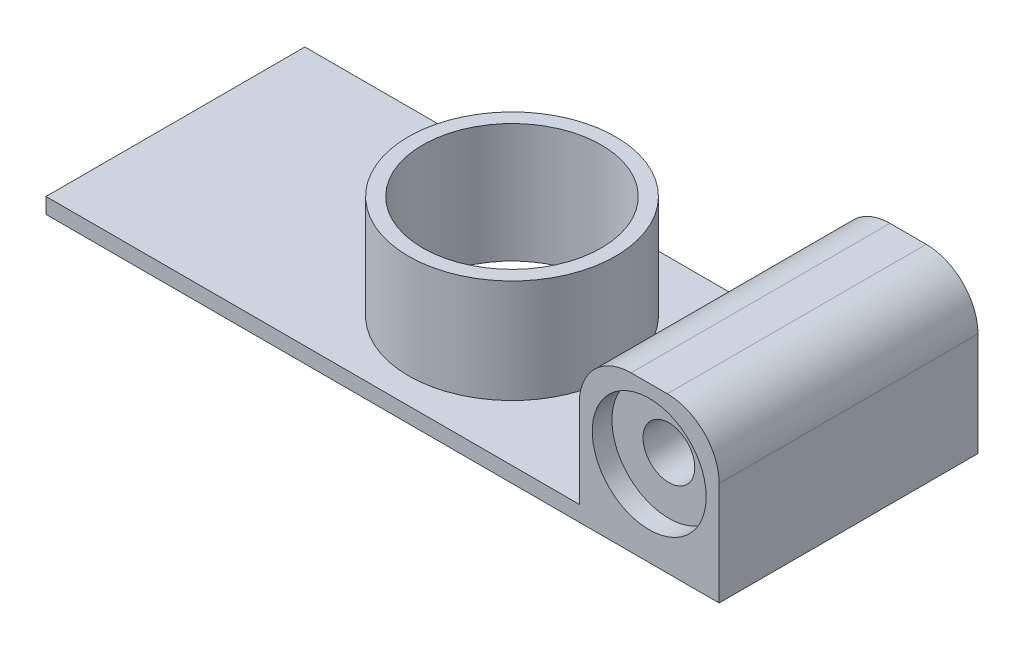
ISO-10303-21;
HEADER;
FILE_DESCRIPTION(('STEP AP214'),'2;1');
FILE_NAME('part.step','',(''),(''),'','','');
FILE_SCHEMA(('AUTOMOTIVE_DESIGN { 1 0 10303 214 1 1 1 1 }'));
ENDSEC;
DATA;
#1=APPLICATION_CONTEXT('core data for automotive mechanical design processes');
#2=APPLICATION_PROTOCOL_DEFINITION('international standard','automotive_design',2000,#1);
#3=PRODUCT_CONTEXT('',#1,'mechanical');
#4=PRODUCT('Part','Part','',(#3));
#5=PRODUCT_RELATED_PRODUCT_CATEGORY('part','',(#4));
#6=PRODUCT_DEFINITION_FORMATION('','',#4);
#7=PRODUCT_DEFINITION_CONTEXT('part definition',#1,'design');
#8=PRODUCT_DEFINITION('design','',#6,#7);
#9=PRODUCT_DEFINITION_SHAPE('','',#8);
#10=(LENGTH_UNIT() NAMED_UNIT(*) SI_UNIT(.MILLI.,.METRE.));
#11=(NAMED_UNIT(*) PLANE_ANGLE_UNIT() SI_UNIT($,.RADIAN.));
#12=(NAMED_UNIT(*) SI_UNIT($,.STERADIAN.) SOLID_ANGLE_UNIT());
#13=UNCERTAINTY_MEASURE_WITH_UNIT(LENGTH_MEASURE(1.E-05),#10,'distance_accuracy_value','');
#14=(GEOMETRIC_REPRESENTATION_CONTEXT(3) GLOBAL_UNCERTAINTY_ASSIGNED_CONTEXT((#13)) GLOBAL_UNIT_ASSIGNED_CONTEXT((#10,
#11,#12)) REPRESENTATION_CONTEXT('',''));
#15=CARTESIAN_POINT('',(0.,0.,0.));
#16=DIRECTION('',(0.,0.,1.));
#17=DIRECTION('',(1.,0.,0.));
#18=AXIS2_PLACEMENT_3D('',#15,#16,#17);
#19=CARTESIAN_POINT('',(65.,6.,-25.));
#20=DIRECTION('',(-1.,0.,0.));
#21=DIRECTION('',(0.,0.,1.));
#22=AXIS2_PLACEMENT_3D('',#19,#20,#21);
#23=PLANE('',#22);
#24=DIRECTION('',(0.,0.,1.));
#25=VECTOR('',#24,1.);
#26=CARTESIAN_POINT('',(65.,3.,25.));
#27=LINE('',#26,#25);
#28=CARTESIAN_POINT('',(65.,3.,-25.));
#29=VERTEX_POINT('',#28);
#30=CARTESIAN_POINT('',(65.,3.,25.));
#31=VERTEX_POINT('',#30);
#32=EDGE_CURVE('E57',#29,#31,#27,.T.);
#33=ORIENTED_EDGE('',*,*,#32,.F.);
#34=DIRECTION('',(0.,-1.,0.));
#35=VECTOR('',#34,1.);
#36=CARTESIAN_POINT('',(65.,6.,-25.));
#37=LINE('',#36,#35);
#38=CARTESIAN_POINT('',(65.,23.,-25.));
#39=VERTEX_POINT('',#38);
#40=EDGE_CURVE('E124',#39,#29,#37,.T.);
#41=ORIENTED_EDGE('',*,*,#40,.F.);
#42=DIRECTION('',(0.,0.,-1.));
#43=VECTOR('',#42,1.);
#44=CARTESIAN_POINT('',(65.,23.,25.));
#45=LINE('',#44,#43);
#46=CARTESIAN_POINT('',(65.,23.,25.));
#47=VERTEX_POINT('',#46);
#48=EDGE_CURVE('E50',#39,#47,#45,.F.);
#49=ORIENTED_EDGE('',*,*,#48,.T.);
#50=DIRECTION('',(0.,-1.,0.));
#51=VECTOR('',#50,1.);
#52=CARTESIAN_POINT('',(65.,6.,25.));
#53=LINE('',#52,#51);
#54=EDGE_CURVE('E136',#47,#31,#53,.T.);
#55=ORIENTED_EDGE('',*,*,#54,.T.);
#56=EDGE_LOOP('',(#33,#41,#49,#55));
#57=FACE_BOUND('',#56,.T.);
#58=ADVANCED_FACE('F40',(#57),#23,.F.);
#59=CARTESIAN_POINT('',(-65.,6.,-25.));
#60=DIRECTION('',(0.,0.,1.));
#61=DIRECTION('',(1.,0.,0.));
#62=AXIS2_PLACEMENT_3D('',#59,#60,#61);
#63=PLANE('',#62);
#64=CARTESIAN_POINT('',(51.5,19.5,-25.));
#65=DIRECTION('',(0.,0.,-1.));
#66=DIRECTION('',(-1.,0.,0.));
#67=AXIS2_PLACEMENT_3D('',#64,#65,#66);
#68=CIRCLE('',#67,11.);
#69=CARTESIAN_POINT('',(40.5,19.5,-25.));
#70=VERTEX_POINT('',#69);
#71=EDGE_CURVE('E416',#70,#70,#68,.T.);
#72=ORIENTED_EDGE('',*,*,#71,.F.);
#73=EDGE_LOOP('',(#72));
#74=FACE_BOUND('',#73,.T.);
#75=DIRECTION('',(1.,0.,0.));
#76=VECTOR('',#75,1.);
#77=CARTESIAN_POINT('',(-65.,3.,-25.));
#78=LINE('',#77,#76);
#79=CARTESIAN_POINT('',(-65.,3.,-25.));
#80=VERTEX_POINT('',#79);
#81=EDGE_CURVE('E109',#80,#29,#78,.T.);
#82=ORIENTED_EDGE('',*,*,#81,.F.);
#83=DIRECTION('',(0.,-1.,0.));
#84=VECTOR('',#83,1.);
#85=CARTESIAN_POINT('',(-65.,6.,-25.));
#86=LINE('',#85,#84);
#87=CARTESIAN_POINT('',(-65.,6.,-25.));
#88=VERTEX_POINT('',#87);
#89=EDGE_CURVE('E122',#88,#80,#86,.T.);
#90=ORIENTED_EDGE('',*,*,#89,.F.);
#91=DIRECTION('',(-1.,0.,0.));
#92=VECTOR('',#91,1.);
#93=CARTESIAN_POINT('',(-65.,6.,-25.));
#94=LINE('',#93,#92);
#95=CARTESIAN_POINT('',(38.,6.,-25.));
#96=VERTEX_POINT('',#95);
#97=EDGE_CURVE('E193',#96,#88,#94,.T.);
#98=ORIENTED_EDGE('',*,*,#97,.F.);
#99=DIRECTION('',(0.,-1.,0.));
#100=VECTOR('',#99,1.);
#101=CARTESIAN_POINT('',(38.,33.,-25.));
#102=LINE('',#101,#100);
#103=CARTESIAN_POINT('',(38.,23.,-25.));
#104=VERTEX_POINT('',#103);
#105=EDGE_CURVE('E179',#104,#96,#102,.T.);
#106=ORIENTED_EDGE('',*,*,#105,.F.);
#107=CARTESIAN_POINT('',(48.,23.,-25.));
#108=DIRECTION('',(0.,0.,1.));
#109=DIRECTION('',(1.,0.,0.));
#110=AXIS2_PLACEMENT_3D('',#107,#108,#109);
#111=CIRCLE('',#110,10.);
#112=CARTESIAN_POINT('',(48.,33.,-25.));
#113=VERTEX_POINT('',#112);
#114=EDGE_CURVE('E149',#104,#113,#111,.F.);
#115=ORIENTED_EDGE('',*,*,#114,.T.);
#116=DIRECTION('',(-1.,0.,0.));
#117=VECTOR('',#116,1.);
#118=CARTESIAN_POINT('',(38.,33.,-25.));
#119=LINE('',#118,#117);
#120=CARTESIAN_POINT('',(55.,33.,-25.));
#121=VERTEX_POINT('',#120);
#122=EDGE_CURVE('E162',#121,#113,#119,.T.);
#123=ORIENTED_EDGE('',*,*,#122,.F.);
#124=CARTESIAN_POINT('',(55.,23.,-25.));
#125=DIRECTION('',(0.,0.,1.));
#126=DIRECTION('',(1.,0.,0.));
#127=AXIS2_PLACEMENT_3D('',#124,#125,#126);
#128=CIRCLE('',#127,10.);
#129=EDGE_CURVE('E157',#121,#39,#128,.F.);
#130=ORIENTED_EDGE('',*,*,#129,.T.);
#131=ORIENTED_EDGE('',*,*,#40,.T.);
#132=EDGE_LOOP('',(#82,#90,#98,#106,#115,#123,#130,#131));
#133=FACE_BOUND('',#132,.T.);
#134=ADVANCED_FACE('F120',(#74,#133),#63,.F.);
#135=CARTESIAN_POINT('',(-65.,6.,-25.));
#136=DIRECTION('',(1.,0.,0.));
#137=DIRECTION('',(0.,0.,-1.));
#138=AXIS2_PLACEMENT_3D('',#135,#136,#137);
#139=PLANE('',#138);
#140=DIRECTION('',(0.,0.,-1.));
#141=VECTOR('',#140,1.);
#142=CARTESIAN_POINT('',(-65.,3.,25.));
#143=LINE('',#142,#141);
#144=CARTESIAN_POINT('',(-65.,3.,25.));
#145=VERTEX_POINT('',#144);
#146=EDGE_CURVE('E105',#145,#80,#143,.T.);
#147=ORIENTED_EDGE('',*,*,#146,.F.);
#148=DIRECTION('',(0.,-1.,0.));
#149=VECTOR('',#148,1.);
#150=CARTESIAN_POINT('',(-65.,6.,25.));
#151=LINE('',#150,#149);
#152=CARTESIAN_POINT('',(-65.,6.,25.));
#153=VERTEX_POINT('',#152);
#154=EDGE_CURVE('E130',#153,#145,#151,.T.);
#155=ORIENTED_EDGE('',*,*,#154,.F.);
#156=DIRECTION('',(0.,0.,1.));
#157=VECTOR('',#156,1.);
#158=CARTESIAN_POINT('',(-65.,6.,-25.));
#159=LINE('',#158,#157);
#160=EDGE_CURVE('E128',#88,#153,#159,.T.);
#161=ORIENTED_EDGE('',*,*,#160,.F.);
#162=ORIENTED_EDGE('',*,*,#89,.T.);
#163=EDGE_LOOP('',(#147,#155,#161,#162));
#164=FACE_BOUND('',#163,.T.);
#165=ADVANCED_FACE('F127',(#164),#139,.F.);
#166=CARTESIAN_POINT('',(-65.,6.,25.));
#167=DIRECTION('',(0.,0.,-1.));
#168=DIRECTION('',(-1.,0.,0.));
#169=AXIS2_PLACEMENT_3D('',#166,#167,#168);
#170=PLANE('',#169);
#171=CARTESIAN_POINT('',(51.5,19.5,25.));
#172=DIRECTION('',(0.,0.,1.));
#173=DIRECTION('',(1.,0.,0.));
#174=AXIS2_PLACEMENT_3D('',#171,#172,#173);
#175=CIRCLE('',#174,11.);
#176=CARTESIAN_POINT('',(62.5,19.5,25.));
#177=VERTEX_POINT('',#176);
#178=EDGE_CURVE('E185',#177,#177,#175,.T.);
#179=ORIENTED_EDGE('',*,*,#178,.F.);
#180=EDGE_LOOP('',(#179));
#181=FACE_BOUND('',#180,.T.);
#182=DIRECTION('',(-1.,0.,0.));
#183=VECTOR('',#182,1.);
#184=CARTESIAN_POINT('',(-65.,3.,25.));
#185=LINE('',#184,#183);
#186=EDGE_CURVE('E110',#31,#145,#185,.T.);
#187=ORIENTED_EDGE('',*,*,#186,.F.);
#188=ORIENTED_EDGE('',*,*,#54,.F.);
#189=CARTESIAN_POINT('',(55.,23.,25.));
#190=DIRECTION('',(0.,0.,-1.));
#191=DIRECTION('',(-1.,0.,0.));
#192=AXIS2_PLACEMENT_3D('',#189,#190,#191);
#193=CIRCLE('',#192,10.);
#194=CARTESIAN_POINT('',(55.,33.,25.));
#195=VERTEX_POINT('',#194);
#196=EDGE_CURVE('E11',#47,#195,#193,.F.);
#197=ORIENTED_EDGE('',*,*,#196,.T.);
#198=DIRECTION('',(1.,0.,0.));
#199=VECTOR('',#198,1.);
#200=CARTESIAN_POINT('',(38.,33.,25.));
#201=LINE('',#200,#199);
#202=CARTESIAN_POINT('',(48.,33.,25.));
#203=VERTEX_POINT('',#202);
#204=EDGE_CURVE('E170',#203,#195,#201,.T.);
#205=ORIENTED_EDGE('',*,*,#204,.F.);
#206=CARTESIAN_POINT('',(48.,23.,25.));
#207=DIRECTION('',(0.,0.,-1.));
#208=DIRECTION('',(-1.,0.,0.));
#209=AXIS2_PLACEMENT_3D('',#206,#207,#208);
#210=CIRCLE('',#209,10.);
#211=CARTESIAN_POINT('',(38.,23.,25.));
#212=VERTEX_POINT('',#211);
#213=EDGE_CURVE('E143',#203,#212,#210,.F.);
#214=ORIENTED_EDGE('',*,*,#213,.T.);
#215=DIRECTION('',(0.,-1.,0.));
#216=VECTOR('',#215,1.);
#217=CARTESIAN_POINT('',(38.,33.,25.));
#218=LINE('',#217,#216);
#219=CARTESIAN_POINT('',(38.,6.,25.));
#220=VERTEX_POINT('',#219);
#221=EDGE_CURVE('E190',#212,#220,#218,.T.);
#222=ORIENTED_EDGE('',*,*,#221,.T.);
#223=DIRECTION('',(1.,0.,0.));
#224=VECTOR('',#223,1.);
#225=CARTESIAN_POINT('',(-65.,6.,25.));
#226=LINE('',#225,#224);
#227=EDGE_CURVE('E198',#153,#220,#226,.T.);
#228=ORIENTED_EDGE('',*,*,#227,.F.);
#229=ORIENTED_EDGE('',*,*,#154,.T.);
#230=EDGE_LOOP('',(#187,#188,#197,#205,#214,#222,#228,#229));
#231=FACE_BOUND('',#230,.T.);
#232=ADVANCED_FACE('F169',(#181,#231),#170,.F.);
#233=CARTESIAN_POINT('',(0.,-34.,0.));
#234=DIRECTION('',(0.,1.,0.));
#235=DIRECTION('',(0.,0.,1.));
#236=AXIS2_PLACEMENT_3D('',#233,#234,#235);
#237=CYLINDRICAL_SURFACE('',#236,17.25);
#238=CARTESIAN_POINT('',(0.,26.,0.));
#239=DIRECTION('',(0.,1.,0.));
#240=DIRECTION('',(0.,0.,1.));
#241=AXIS2_PLACEMENT_3D('',#238,#239,#240);
#242=CIRCLE('',#241,17.25);
#243=CARTESIAN_POINT('',(0.,26.,17.25));
#244=VERTEX_POINT('',#243);
#245=EDGE_CURVE('E393',#244,#244,#242,.T.);
#246=CARTESIAN_POINT('',(0.,3.,0.));
#247=DIRECTION('',(0.,-1.,0.));
#248=DIRECTION('',(0.,0.,-1.));
#249=AXIS2_PLACEMENT_3D('',#246,#247,#248);
#250=CIRCLE('',#249,17.25);
#251=CARTESIAN_POINT('',(0.,3.00000000000001,17.25));
#252=VERTEX_POINT('',#251);
#253=EDGE_CURVE('E44',#252,#252,#250,.F.);
#254=CARTESIAN_POINT('',(0.,26.,17.25));
#255=CARTESIAN_POINT('',(0.,25.7604166666667,17.25));
#256=CARTESIAN_POINT('',(0.,25.5208333333333,17.25));
#257=CARTESIAN_POINT('',(0.,25.0416666666667,17.25));
#258=CARTESIAN_POINT('',(0.,24.8020833333333,17.25));
#259=CARTESIAN_POINT('',(0.,24.3229166666667,17.25));
#260=CARTESIAN_POINT('',(0.,24.0833333333333,17.25));
#261=CARTESIAN_POINT('',(0.,23.6041666666667,17.25));
#262=CARTESIAN_POINT('',(0.,23.3645833333333,17.25));
#263=CARTESIAN_POINT('',(0.,22.8854166666667,17.25));
#264=CARTESIAN_POINT('',(0.,22.6458333333333,17.25));
#265=CARTESIAN_POINT('',(0.,22.1666666666667,17.25));
#266=CARTESIAN_POINT('',(0.,21.9270833333333,17.25));
#267=CARTESIAN_POINT('',(0.,21.4479166666667,17.25));
#268=CARTESIAN_POINT('',(0.,21.2083333333333,17.25));
#269=CARTESIAN_POINT('',(0.,20.7291666666667,17.25));
#270=CARTESIAN_POINT('',(0.,20.4895833333333,17.25));
#271=CARTESIAN_POINT('',(0.,20.0104166666667,17.25));
#272=CARTESIAN_POINT('',(0.,19.7708333333333,17.25));
#273=CARTESIAN_POINT('',(0.,19.2916666666667,17.25));
#274=CARTESIAN_POINT('',(0.,19.0520833333333,17.25));
#275=CARTESIAN_POINT('',(0.,18.5729166666667,17.25));
#276=CARTESIAN_POINT('',(0.,18.3333333333333,17.25));
#277=CARTESIAN_POINT('',(0.,17.8541666666667,17.25));
#278=CARTESIAN_POINT('',(0.,17.6145833333333,17.25));
#279=CARTESIAN_POINT('',(0.,17.1354166666667,17.25));
#280=CARTESIAN_POINT('',(0.,16.8958333333333,17.25));
#281=CARTESIAN_POINT('',(0.,16.4166666666667,17.25));
#282=CARTESIAN_POINT('',(0.,16.1770833333333,17.25));
#283=CARTESIAN_POINT('',(0.,15.6979166666667,17.25));
#284=CARTESIAN_POINT('',(0.,15.4583333333333,17.25));
#285=CARTESIAN_POINT('',(0.,14.9791666666667,17.25));
#286=CARTESIAN_POINT('',(0.,14.7395833333333,17.25));
#287=CARTESIAN_POINT('',(0.,14.2604166666667,17.25));
#288=CARTESIAN_POINT('',(0.,14.0208333333333,17.25));
#289=CARTESIAN_POINT('',(0.,13.5416666666667,17.25));
#290=CARTESIAN_POINT('',(0.,13.3020833333333,17.25));
#291=CARTESIAN_POINT('',(0.,12.8229166666667,17.25));
#292=CARTESIAN_POINT('',(0.,12.5833333333333,17.25));
#293=CARTESIAN_POINT('',(0.,12.1041666666667,17.25));
#294=CARTESIAN_POINT('',(0.,11.8645833333333,17.25));
#295=CARTESIAN_POINT('',(0.,11.3854166666667,17.25));
#296=CARTESIAN_POINT('',(0.,11.1458333333333,17.25));
#297=CARTESIAN_POINT('',(0.,10.6666666666667,17.25));
#298=CARTESIAN_POINT('',(0.,10.4270833333333,17.25));
#299=CARTESIAN_POINT('',(0.,9.94791666666667,17.25));
#300=CARTESIAN_POINT('',(0.,9.70833333333334,17.25));
#301=CARTESIAN_POINT('',(0.,9.22916666666667,17.25));
#302=CARTESIAN_POINT('',(0.,8.98958333333334,17.25));
#303=CARTESIAN_POINT('',(0.,8.51041666666667,17.25));
#304=CARTESIAN_POINT('',(0.,8.27083333333334,17.25));
#305=CARTESIAN_POINT('',(0.,7.79166666666668,17.25));
#306=CARTESIAN_POINT('',(0.,7.55208333333334,17.25));
#307=CARTESIAN_POINT('',(0.,7.07291666666667,17.25));
#308=CARTESIAN_POINT('',(0.,6.83333333333334,17.25));
#309=CARTESIAN_POINT('',(0.,6.35416666666668,17.25));
#310=CARTESIAN_POINT('',(0.,6.11458333333334,17.25));
#311=CARTESIAN_POINT('',(0.,5.63541666666668,17.25));
#312=CARTESIAN_POINT('',(0.,5.39583333333334,17.25));
#313=CARTESIAN_POINT('',(0.,4.91666666666668,17.25));
#314=CARTESIAN_POINT('',(0.,4.67708333333334,17.25));
#315=CARTESIAN_POINT('',(0.,4.19791666666668,17.25));
#316=CARTESIAN_POINT('',(0.,3.95833333333335,17.25));
#317=CARTESIAN_POINT('',(0.,3.47916666666668,17.25));
#318=CARTESIAN_POINT('',(0.,3.23958333333334,17.25));
#319=CARTESIAN_POINT('',(0.,3.00000000000001,17.25));
#320=B_SPLINE_CURVE_WITH_KNOTS('',3,(#254,#255,#256,#257,#258,#259,#260,#261,#262,#263,#264,
#265,#266,#267,#268,#269,#270,#271,#272,#273,#274,#275,#276,#277,#278,#279,#280,#281,#282,#283,
#284,#285,#286,#287,#288,#289,#290,#291,#292,#293,#294,#295,#296,#297,#298,#299,#300,#301,#302,
#303,#304,#305,#306,#307,#308,#309,#310,#311,#312,#313,#314,#315,#316,#317,#318,#319),
.UNSPECIFIED.,.F.,.F.,(4,2,2,2,2,2,2,2,2,2,2,2,2,2,2,2,2,2,2,2,2,2,2,2,2,2,2,2,2,2,2,2,4),(0.,
0.718749999999997,1.4375,2.15625,2.875,3.59375,4.3125,5.03125,5.75,6.46875,7.1875,7.90625,
8.62499999999999,9.34375,10.0625,10.78125,11.5,12.21875,12.9375,13.65625,14.375,15.09375,
15.8125,16.53125,17.25,17.96875,18.6875,19.40625,20.125,20.84375,21.5625,22.28125,23.),.UNSPECIFIED.);
#321=EDGE_CURVE('BSEAM237',#244,#252,#320,.T.);
#322=ORIENTED_EDGE('',*,*,#245,.T.);
#323=ORIENTED_EDGE('',*,*,#253,.F.);
#324=ORIENTED_EDGE('',*,*,#321,.T.);
#325=ORIENTED_EDGE('',*,*,#321,.F.);
#326=EDGE_LOOP('',(#322,#324,#323,#325));
#327=FACE_BOUND('',#326,.T.);
#328=ADVANCED_FACE('F237',(#327),#237,.F.);
#329=CARTESIAN_POINT('',(0.,6.,0.));
#330=DIRECTION('',(0.,1.,0.));
#331=DIRECTION('',(0.,0.,1.));
#332=AXIS2_PLACEMENT_3D('',#329,#330,#331);
#333=PLANE('',#332);
#334=CARTESIAN_POINT('',(0.,6.,0.));
#335=DIRECTION('',(0.,1.,0.));
#336=DIRECTION('',(0.,0.,1.));
#337=AXIS2_PLACEMENT_3D('',#334,#335,#336);
#338=CIRCLE('',#337,20.);
#339=CARTESIAN_POINT('',(0.,6.,20.));
#340=VERTEX_POINT('',#339);
#341=EDGE_CURVE('E399',#340,#340,#338,.T.);
#342=ORIENTED_EDGE('',*,*,#341,.F.);
#343=EDGE_LOOP('',(#342));
#344=FACE_BOUND('',#343,.T.);
#345=DIRECTION('',(0.,0.,1.));
#346=VECTOR('',#345,1.);
#347=CARTESIAN_POINT('',(38.,6.,-25.));
#348=LINE('',#347,#346);
#349=EDGE_CURVE('E175',#96,#220,#348,.T.);
#350=ORIENTED_EDGE('',*,*,#349,.F.);
#351=ORIENTED_EDGE('',*,*,#97,.T.);
#352=ORIENTED_EDGE('',*,*,#160,.T.);
#353=ORIENTED_EDGE('',*,*,#227,.T.);
#354=EDGE_LOOP('',(#350,#351,#352,#353));
#355=FACE_BOUND('',#354,.T.);
#356=ADVANCED_FACE('F205',(#344,#355),#333,.T.);
#357=CARTESIAN_POINT('',(38.,33.,-25.));
#358=DIRECTION('',(1.,0.,0.));
#359=DIRECTION('',(0.,0.,-1.));
#360=AXIS2_PLACEMENT_3D('',#357,#358,#359);
#361=PLANE('',#360);
#362=ORIENTED_EDGE('',*,*,#221,.F.);
#363=DIRECTION('',(0.,0.,1.));
#364=VECTOR('',#363,1.);
#365=CARTESIAN_POINT('',(38.,23.,-25.));
#366=LINE('',#365,#364);
#367=EDGE_CURVE('E146',#212,#104,#366,.F.);
#368=ORIENTED_EDGE('',*,*,#367,.T.);
#369=ORIENTED_EDGE('',*,*,#105,.T.);
#370=ORIENTED_EDGE('',*,*,#349,.T.);
#371=EDGE_LOOP('',(#362,#368,#369,#370));
#372=FACE_BOUND('',#371,.T.);
#373=ADVANCED_FACE('F208',(#372),#361,.F.);
#374=CARTESIAN_POINT('',(0.,33.,0.));
#375=DIRECTION('',(0.,1.,0.));
#376=DIRECTION('',(0.,0.,1.));
#377=AXIS2_PLACEMENT_3D('',#374,#375,#376);
#378=PLANE('',#377);
#379=ORIENTED_EDGE('',*,*,#204,.T.);
#380=DIRECTION('',(0.,0.,-1.));
#381=VECTOR('',#380,1.);
#382=CARTESIAN_POINT('',(55.,33.,-25.));
#383=LINE('',#382,#381);
#384=EDGE_CURVE('E153',#195,#121,#383,.T.);
#385=ORIENTED_EDGE('',*,*,#384,.T.);
#386=ORIENTED_EDGE('',*,*,#122,.T.);
#387=DIRECTION('',(0.,0.,1.));
#388=VECTOR('',#387,1.);
#389=CARTESIAN_POINT('',(48.,33.,25.));
#390=LINE('',#389,#388);
#391=EDGE_CURVE('E134',#113,#203,#390,.T.);
#392=ORIENTED_EDGE('',*,*,#391,.T.);
#393=EDGE_LOOP('',(#379,#385,#386,#392));
#394=FACE_BOUND('',#393,.T.);
#395=ADVANCED_FACE('F172',(#394),#378,.T.);
#396=CARTESIAN_POINT('',(51.5,19.5,21.2));
#397=DIRECTION('',(0.,0.,1.));
#398=DIRECTION('',(1.,0.,0.));
#399=AXIS2_PLACEMENT_3D('',#396,#397,#398);
#400=CYLINDRICAL_SURFACE('',#399,11.);
#401=CARTESIAN_POINT('',(51.5,19.5,21.2));
#402=DIRECTION('',(0.,0.,1.));
#403=DIRECTION('',(1.,0.,0.));
#404=AXIS2_PLACEMENT_3D('',#401,#402,#403);
#405=CIRCLE('',#404,11.);
#406=CARTESIAN_POINT('',(62.5,19.5,21.2));
#407=VERTEX_POINT('',#406);
#408=EDGE_CURVE('E182',#407,#407,#405,.T.);
#409=CARTESIAN_POINT('',(62.5,19.5,21.2));
#410=CARTESIAN_POINT('',(62.5,19.5,21.2395833333333));
#411=CARTESIAN_POINT('',(62.5,19.5,21.2791666666667));
#412=CARTESIAN_POINT('',(62.5,19.5,21.3583333333333));
#413=CARTESIAN_POINT('',(62.5,19.5,21.3979166666667));
#414=CARTESIAN_POINT('',(62.5,19.5,21.4770833333333));
#415=CARTESIAN_POINT('',(62.5,19.5,21.5166666666667));
#416=CARTESIAN_POINT('',(62.5,19.5,21.5958333333333));
#417=CARTESIAN_POINT('',(62.5,19.5,21.6354166666667));
#418=CARTESIAN_POINT('',(62.5,19.5,21.7145833333333));
#419=CARTESIAN_POINT('',(62.5,19.5,21.7541666666667));
#420=CARTESIAN_POINT('',(62.5,19.5,21.8333333333333));
#421=CARTESIAN_POINT('',(62.5,19.5,21.8729166666667));
#422=CARTESIAN_POINT('',(62.5,19.5,21.9520833333333));
#423=CARTESIAN_POINT('',(62.5,19.5,21.9916666666667));
#424=CARTESIAN_POINT('',(62.5,19.5,22.0708333333333));
#425=CARTESIAN_POINT('',(62.5,19.5,22.1104166666667));
#426=CARTESIAN_POINT('',(62.5,19.5,22.1895833333333));
#427=CARTESIAN_POINT('',(62.5,19.5,22.2291666666667));
#428=CARTESIAN_POINT('',(62.5,19.5,22.3083333333333));
#429=CARTESIAN_POINT('',(62.5,19.5,22.3479166666667));
#430=CARTESIAN_POINT('',(62.5,19.5,22.4270833333333));
#431=CARTESIAN_POINT('',(62.5,19.5,22.4666666666667));
#432=CARTESIAN_POINT('',(62.5,19.5,22.5458333333333));
#433=CARTESIAN_POINT('',(62.5,19.5,22.5854166666667));
#434=CARTESIAN_POINT('',(62.5,19.5,22.6645833333333));
#435=CARTESIAN_POINT('',(62.5,19.5,22.7041666666667));
#436=CARTESIAN_POINT('',(62.5,19.5,22.7833333333333));
#437=CARTESIAN_POINT('',(62.5,19.5,22.8229166666667));
#438=CARTESIAN_POINT('',(62.5,19.5,22.9020833333333));
#439=CARTESIAN_POINT('',(62.5,19.5,22.9416666666667));
#440=CARTESIAN_POINT('',(62.5,19.5,23.0208333333333));
#441=CARTESIAN_POINT('',(62.5,19.5,23.0604166666667));
#442=CARTESIAN_POINT('',(62.5,19.5,23.1395833333333));
#443=CARTESIAN_POINT('',(62.5,19.5,23.1791666666667));
#444=CARTESIAN_POINT('',(62.5,19.5,23.2583333333333));
#445=CARTESIAN_POINT('',(62.5,19.5,23.2979166666667));
#446=CARTESIAN_POINT('',(62.5,19.5,23.3770833333333));
#447=CARTESIAN_POINT('',(62.5,19.5,23.4166666666667));
#448=CARTESIAN_POINT('',(62.5,19.5,23.4958333333333));
#449=CARTESIAN_POINT('',(62.5,19.5,23.5354166666667));
#450=CARTESIAN_POINT('',(62.5,19.5,23.6145833333333));
#451=CARTESIAN_POINT('',(62.5,19.5,23.6541666666667));
#452=CARTESIAN_POINT('',(62.5,19.5,23.7333333333333));
#453=CARTESIAN_POINT('',(62.5,19.5,23.7729166666667));
#454=CARTESIAN_POINT('',(62.5,19.5,23.8520833333333));
#455=CARTESIAN_POINT('',(62.5,19.5,23.8916666666667));
#456=CARTESIAN_POINT('',(62.5,19.5,23.9708333333333));
#457=CARTESIAN_POINT('',(62.5,19.5,24.0104166666667));
#458=CARTESIAN_POINT('',(62.5,19.5,24.0895833333333));
#459=CARTESIAN_POINT('',(62.5,19.5,24.1291666666667));
#460=CARTESIAN_POINT('',(62.5,19.5,24.2083333333333));
#461=CARTESIAN_POINT('',(62.5,19.5,24.2479166666667));
#462=CARTESIAN_POINT('',(62.5,19.5,24.3270833333333));
#463=CARTESIAN_POINT('',(62.5,19.5,24.3666666666667));
#464=CARTESIAN_POINT('',(62.5,19.5,24.4458333333333));
#465=CARTESIAN_POINT('',(62.5,19.5,24.4854166666667));
#466=CARTESIAN_POINT('',(62.5,19.5,24.5645833333333));
#467=CARTESIAN_POINT('',(62.5,19.5,24.6041666666667));
#468=CARTESIAN_POINT('',(62.5,19.5,24.6833333333333));
#469=CARTESIAN_POINT('',(62.5,19.5,24.7229166666667));
#470=CARTESIAN_POINT('',(62.5,19.5,24.8020833333333));
#471=CARTESIAN_POINT('',(62.5,19.5,24.8416666666667));
#472=CARTESIAN_POINT('',(62.5,19.5,24.9208333333333));
#473=CARTESIAN_POINT('',(62.5,19.5,24.9604166666667));
#474=CARTESIAN_POINT('',(62.5,19.5,25.));
#475=B_SPLINE_CURVE_WITH_KNOTS('',3,(#409,#410,#411,#412,#413,#414,#415,#416,#417,#418,#419,
#420,#421,#422,#423,#424,#425,#426,#427,#428,#429,#430,#431,#432,#433,#434,#435,#436,#437,#438,
#439,#440,#441,#442,#443,#444,#445,#446,#447,#448,#449,#450,#451,#452,#453,#454,#455,#456,#457,
#458,#459,#460,#461,#462,#463,#464,#465,#466,#467,#468,#469,#470,#471,#472,#473,#474),
.UNSPECIFIED.,.F.,.F.,(4,2,2,2,2,2,2,2,2,2,2,2,2,2,2,2,2,2,2,2,2,2,2,2,2,2,2,2,2,2,2,2,4),(0.,
0.118750000000001,0.237500000000002,0.356250000000002,0.475000000000003,0.593750000000001,
0.712500000000001,0.831250000000002,0.950000000000003,1.06875,1.1875,1.30625,1.425,1.54375,
1.6625,1.78125,1.9,2.01875,2.1375,2.25625,2.375,2.49375,2.6125,2.73125,2.85,2.96875,3.0875,
3.20625,3.325,3.44375,3.5625,3.68125,3.8),.UNSPECIFIED.);
#476=EDGE_CURVE('BSEAM246',#407,#177,#475,.T.);
#477=ORIENTED_EDGE('',*,*,#408,.F.);
#478=ORIENTED_EDGE('',*,*,#178,.T.);
#479=ORIENTED_EDGE('',*,*,#476,.T.);
#480=ORIENTED_EDGE('',*,*,#476,.F.);
#481=EDGE_LOOP('',(#477,#479,#478,#480));
#482=FACE_BOUND('',#481,.T.);
#483=ADVANCED_FACE('F246',(#482),#400,.F.);
#484=CARTESIAN_POINT('',(51.5,19.5,21.2));
#485=DIRECTION('',(0.,0.,1.));
#486=DIRECTION('',(1.,0.,0.));
#487=AXIS2_PLACEMENT_3D('',#484,#485,#486);
#488=PLANE('',#487);
#489=CARTESIAN_POINT('',(51.5,19.5,21.2));
#490=DIRECTION('',(0.,0.,1.));
#491=DIRECTION('',(1.,0.,0.));
#492=AXIS2_PLACEMENT_3D('',#489,#490,#491);
#493=CIRCLE('',#492,5.);
#494=CARTESIAN_POINT('',(56.5,19.5,21.2));
#495=VERTEX_POINT('',#494);
#496=EDGE_CURVE('E421',#495,#495,#493,.T.);
#497=ORIENTED_EDGE('',*,*,#496,.F.);
#498=EDGE_LOOP('',(#497));
#499=FACE_BOUND('',#498,.T.);
#500=ORIENTED_EDGE('',*,*,#408,.T.);
#501=EDGE_LOOP('',(#500));
#502=FACE_BOUND('',#501,.T.);
#503=ADVANCED_FACE('F249',(#499,#502),#488,.T.);
#504=CARTESIAN_POINT('',(51.5,19.5,9.20000000000001));
#505=DIRECTION('',(0.,0.,1.));
#506=DIRECTION('',(1.,0.,0.));
#507=AXIS2_PLACEMENT_3D('',#504,#505,#506);
#508=CYLINDRICAL_SURFACE('',#507,5.);
#509=ORIENTED_EDGE('',*,*,#496,.T.);
#510=EDGE_LOOP('',(#509));
#511=FACE_BOUND('',#510,.T.);
#512=CARTESIAN_POINT('',(51.5,19.5,-21.2));
#513=DIRECTION('',(0.,0.,-1.));
#514=DIRECTION('',(-1.,0.,0.));
#515=AXIS2_PLACEMENT_3D('',#512,#513,#514);
#516=CIRCLE('',#515,5.);
#517=CARTESIAN_POINT('',(46.5,19.5,-21.2));
#518=VERTEX_POINT('',#517);
#519=EDGE_CURVE('E409',#518,#518,#516,.T.);
#520=ORIENTED_EDGE('',*,*,#519,.T.);
#521=EDGE_LOOP('',(#520));
#522=FACE_BOUND('',#521,.T.);
#523=ADVANCED_FACE('F253',(#511,#522),#508,.F.);
#524=CARTESIAN_POINT('',(51.5,19.5,-21.2));
#525=DIRECTION('',(0.,0.,-1.));
#526=DIRECTION('',(-1.,0.,0.));
#527=AXIS2_PLACEMENT_3D('',#524,#525,#526);
#528=CYLINDRICAL_SURFACE('',#527,11.);
#529=CARTESIAN_POINT('',(51.5,19.5,-21.2));
#530=DIRECTION('',(0.,0.,-1.));
#531=DIRECTION('',(-1.,0.,0.));
#532=AXIS2_PLACEMENT_3D('',#529,#530,#531);
#533=CIRCLE('',#532,11.);
#534=CARTESIAN_POINT('',(40.5,19.5,-21.2));
#535=VERTEX_POINT('',#534);
#536=EDGE_CURVE('E417',#535,#535,#533,.T.);
#537=CARTESIAN_POINT('',(40.5,19.5,-21.2));
#538=CARTESIAN_POINT('',(40.5,19.5,-21.2395833333333));
#539=CARTESIAN_POINT('',(40.5,19.5,-21.2791666666667));
#540=CARTESIAN_POINT('',(40.5,19.5,-21.3583333333333));
#541=CARTESIAN_POINT('',(40.5,19.5,-21.3979166666667));
#542=CARTESIAN_POINT('',(40.5,19.5,-21.4770833333333));
#543=CARTESIAN_POINT('',(40.5,19.5,-21.5166666666667));
#544=CARTESIAN_POINT('',(40.5,19.5,-21.5958333333333));
#545=CARTESIAN_POINT('',(40.5,19.5,-21.6354166666667));
#546=CARTESIAN_POINT('',(40.5,19.5,-21.7145833333333));
#547=CARTESIAN_POINT('',(40.5,19.5,-21.7541666666667));
#548=CARTESIAN_POINT('',(40.5,19.5,-21.8333333333333));
#549=CARTESIAN_POINT('',(40.5,19.5,-21.8729166666667));
#550=CARTESIAN_POINT('',(40.5,19.5,-21.9520833333333));
#551=CARTESIAN_POINT('',(40.5,19.5,-21.9916666666667));
#552=CARTESIAN_POINT('',(40.5,19.5,-22.0708333333333));
#553=CARTESIAN_POINT('',(40.5,19.5,-22.1104166666667));
#554=CARTESIAN_POINT('',(40.5,19.5,-22.1895833333333));
#555=CARTESIAN_POINT('',(40.5,19.5,-22.2291666666667));
#556=CARTESIAN_POINT('',(40.5,19.5,-22.3083333333333));
#557=CARTESIAN_POINT('',(40.5,19.5,-22.3479166666667));
#558=CARTESIAN_POINT('',(40.5,19.5,-22.4270833333333));
#559=CARTESIAN_POINT('',(40.5,19.5,-22.4666666666667));
#560=CARTESIAN_POINT('',(40.5,19.5,-22.5458333333333));
#561=CARTESIAN_POINT('',(40.5,19.5,-22.5854166666667));
#562=CARTESIAN_POINT('',(40.5,19.5,-22.6645833333333));
#563=CARTESIAN_POINT('',(40.5,19.5,-22.7041666666667));
#564=CARTESIAN_POINT('',(40.5,19.5,-22.7833333333333));
#565=CARTESIAN_POINT('',(40.5,19.5,-22.8229166666667));
#566=CARTESIAN_POINT('',(40.5,19.5,-22.9020833333333));
#567=CARTESIAN_POINT('',(40.5,19.5,-22.9416666666667));
#568=CARTESIAN_POINT('',(40.5,19.5,-23.0208333333333));
#569=CARTESIAN_POINT('',(40.5,19.5,-23.0604166666667));
#570=CARTESIAN_POINT('',(40.5,19.5,-23.1395833333333));
#571=CARTESIAN_POINT('',(40.5,19.5,-23.1791666666667));
#572=CARTESIAN_POINT('',(40.5,19.5,-23.2583333333333));
#573=CARTESIAN_POINT('',(40.5,19.5,-23.2979166666667));
#574=CARTESIAN_POINT('',(40.5,19.5,-23.3770833333333));
#575=CARTESIAN_POINT('',(40.5,19.5,-23.4166666666667));
#576=CARTESIAN_POINT('',(40.5,19.5,-23.4958333333333));
#577=CARTESIAN_POINT('',(40.5,19.5,-23.5354166666667));
#578=CARTESIAN_POINT('',(40.5,19.5,-23.6145833333333));
#579=CARTESIAN_POINT('',(40.5,19.5,-23.6541666666667));
#580=CARTESIAN_POINT('',(40.5,19.5,-23.7333333333333));
#581=CARTESIAN_POINT('',(40.5,19.5,-23.7729166666667));
#582=CARTESIAN_POINT('',(40.5,19.5,-23.8520833333333));
#583=CARTESIAN_POINT('',(40.5,19.5,-23.8916666666667));
#584=CARTESIAN_POINT('',(40.5,19.5,-23.9708333333333));
#585=CARTESIAN_POINT('',(40.5,19.5,-24.0104166666667));
#586=CARTESIAN_POINT('',(40.5,19.5,-24.0895833333333));
#587=CARTESIAN_POINT('',(40.5,19.5,-24.1291666666667));
#588=CARTESIAN_POINT('',(40.5,19.5,-24.2083333333333));
#589=CARTESIAN_POINT('',(40.5,19.5,-24.2479166666667));
#590=CARTESIAN_POINT('',(40.5,19.5,-24.3270833333333));
#591=CARTESIAN_POINT('',(40.5,19.5,-24.3666666666667));
#592=CARTESIAN_POINT('',(40.5,19.5,-24.4458333333333));
#593=CARTESIAN_POINT('',(40.5,19.5,-24.4854166666667));
#594=CARTESIAN_POINT('',(40.5,19.5,-24.5645833333333));
#595=CARTESIAN_POINT('',(40.5,19.5,-24.6041666666667));
#596=CARTESIAN_POINT('',(40.5,19.5,-24.6833333333333));
#597=CARTESIAN_POINT('',(40.5,19.5,-24.7229166666667));
#598=CARTESIAN_POINT('',(40.5,19.5,-24.8020833333333));
#599=CARTESIAN_POINT('',(40.5,19.5,-24.8416666666667));
#600=CARTESIAN_POINT('',(40.5,19.5,-24.9208333333333));
#601=CARTESIAN_POINT('',(40.5,19.5,-24.9604166666667));
#602=CARTESIAN_POINT('',(40.5,19.5,-25.));
#603=B_SPLINE_CURVE_WITH_KNOTS('',3,(#537,#538,#539,#540,#541,#542,#543,#544,#545,#546,#547,
#548,#549,#550,#551,#552,#553,#554,#555,#556,#557,#558,#559,#560,#561,#562,#563,#564,#565,#566,
#567,#568,#569,#570,#571,#572,#573,#574,#575,#576,#577,#578,#579,#580,#581,#582,#583,#584,#585,
#586,#587,#588,#589,#590,#591,#592,#593,#594,#595,#596,#597,#598,#599,#600,#601,#602),
.UNSPECIFIED.,.F.,.F.,(4,2,2,2,2,2,2,2,2,2,2,2,2,2,2,2,2,2,2,2,2,2,2,2,2,2,2,2,2,2,2,2,4),(0.,
0.118750000000001,0.237500000000002,0.356250000000002,0.475000000000003,0.593750000000001,
0.712500000000001,0.831250000000002,0.950000000000003,1.06875,1.1875,1.30625,1.425,1.54375,
1.6625,1.78125,1.9,2.01875,2.1375,2.25625,2.375,2.49375,2.6125,2.73125,2.85,2.96875,3.0875,
3.20625,3.325,3.44375,3.5625,3.68125,3.8),.UNSPECIFIED.);
#604=EDGE_CURVE('BSEAM221',#535,#70,#603,.T.);
#605=ORIENTED_EDGE('',*,*,#536,.F.);
#606=ORIENTED_EDGE('',*,*,#71,.T.);
#607=ORIENTED_EDGE('',*,*,#604,.T.);
#608=ORIENTED_EDGE('',*,*,#604,.F.);
#609=EDGE_LOOP('',(#605,#607,#606,#608));
#610=FACE_BOUND('',#609,.T.);
#611=ADVANCED_FACE('F221',(#610),#528,.F.);
#612=CARTESIAN_POINT('',(51.5,19.5,-21.2));
#613=DIRECTION('',(0.,0.,-1.));
#614=DIRECTION('',(-1.,0.,0.));
#615=AXIS2_PLACEMENT_3D('',#612,#613,#614);
#616=PLANE('',#615);
#617=ORIENTED_EDGE('',*,*,#519,.F.);
#618=EDGE_LOOP('',(#617));
#619=FACE_BOUND('',#618,.T.);
#620=ORIENTED_EDGE('',*,*,#536,.T.);
#621=EDGE_LOOP('',(#620));
#622=FACE_BOUND('',#621,.T.);
#623=ADVANCED_FACE('F215',(#619,#622),#616,.T.);
#624=CARTESIAN_POINT('',(48.,23.,0.));
#625=DIRECTION('',(0.,0.,-1.));
#626=DIRECTION('',(-1.,0.,0.));
#627=AXIS2_PLACEMENT_3D('',#624,#625,#626);
#628=CYLINDRICAL_SURFACE('',#627,10.);
#629=ORIENTED_EDGE('',*,*,#114,.F.);
#630=ORIENTED_EDGE('',*,*,#367,.F.);
#631=ORIENTED_EDGE('',*,*,#213,.F.);
#632=ORIENTED_EDGE('',*,*,#391,.F.);
#633=EDGE_LOOP('',(#629,#630,#631,#632));
#634=FACE_BOUND('',#633,.T.);
#635=ADVANCED_FACE('F213',(#634),#628,.T.);
#636=CARTESIAN_POINT('',(55.,23.,0.));
#637=DIRECTION('',(0.,0.,1.));
#638=DIRECTION('',(1.,0.,0.));
#639=AXIS2_PLACEMENT_3D('',#636,#637,#638);
#640=CYLINDRICAL_SURFACE('',#639,10.);
#641=ORIENTED_EDGE('',*,*,#196,.F.);
#642=ORIENTED_EDGE('',*,*,#48,.F.);
#643=ORIENTED_EDGE('',*,*,#129,.F.);
#644=ORIENTED_EDGE('',*,*,#384,.F.);
#645=EDGE_LOOP('',(#641,#642,#643,#644));
#646=FACE_BOUND('',#645,.T.);
#647=ADVANCED_FACE('F42',(#646),#640,.T.);
#648=CARTESIAN_POINT('',(0.,26.,0.));
#649=DIRECTION('',(0.,-1.,0.));
#650=DIRECTION('',(0.,0.,-1.));
#651=AXIS2_PLACEMENT_3D('',#648,#649,#650);
#652=CYLINDRICAL_SURFACE('',#651,20.);
#653=CARTESIAN_POINT('',(0.,26.,0.));
#654=DIRECTION('',(0.,1.,0.));
#655=DIRECTION('',(0.,0.,1.));
#656=AXIS2_PLACEMENT_3D('',#653,#654,#655);
#657=CIRCLE('',#656,20.);
#658=CARTESIAN_POINT('',(0.,26.,20.));
#659=VERTEX_POINT('',#658);
#660=EDGE_CURVE('E405',#659,#659,#657,.T.);
#661=ORIENTED_EDGE('',*,*,#660,.F.);
#662=EDGE_LOOP('',(#661));
#663=FACE_BOUND('',#662,.T.);
#664=ORIENTED_EDGE('',*,*,#341,.T.);
#665=EDGE_LOOP('',(#664));
#666=FACE_BOUND('',#665,.T.);
#667=ADVANCED_FACE('F220',(#663,#666),#652,.T.);
#668=CARTESIAN_POINT('',(0.,26.,0.));
#669=DIRECTION('',(0.,1.,0.));
#670=DIRECTION('',(0.,0.,1.));
#671=AXIS2_PLACEMENT_3D('',#668,#669,#670);
#672=PLANE('',#671);
#673=ORIENTED_EDGE('',*,*,#245,.F.);
#674=EDGE_LOOP('',(#673));
#675=FACE_BOUND('',#674,.T.);
#676=ORIENTED_EDGE('',*,*,#660,.T.);
#677=EDGE_LOOP('',(#676));
#678=FACE_BOUND('',#677,.T.);
#679=ADVANCED_FACE('F263',(#675,#678),#672,.T.);
#680=CARTESIAN_POINT('',(0.,3.,0.));
#681=DIRECTION('',(0.,-1.,0.));
#682=DIRECTION('',(0.,0.,-1.));
#683=AXIS2_PLACEMENT_3D('',#680,#681,#682);
#684=PLANE('',#683);
#685=ORIENTED_EDGE('',*,*,#146,.T.);
#686=ORIENTED_EDGE('',*,*,#81,.T.);
#687=ORIENTED_EDGE('',*,*,#32,.T.);
#688=ORIENTED_EDGE('',*,*,#186,.T.);
#689=EDGE_LOOP('',(#685,#686,#687,#688));
#690=FACE_BOUND('',#689,.T.);
#691=ORIENTED_EDGE('',*,*,#253,.T.);
#692=EDGE_LOOP('',(#691));
#693=FACE_BOUND('',#692,.T.);
#694=ADVANCED_FACE('F107',(#690,#693),#684,.T.);
#695=CLOSED_SHELL('',(#58,#134,#165,#232,#328,#356,#373,#395,#483,#503,#523,#611,#623,#635,#647,
#667,#679,#694));
#696=MANIFOLD_SOLID_BREP('B2',#695);
#697=ADVANCED_BREP_SHAPE_REPRESENTATION('',(#18,#696),#14);
#698=SHAPE_DEFINITION_REPRESENTATION(#9,#697);
ENDSEC;
END-ISO-10303-21;
